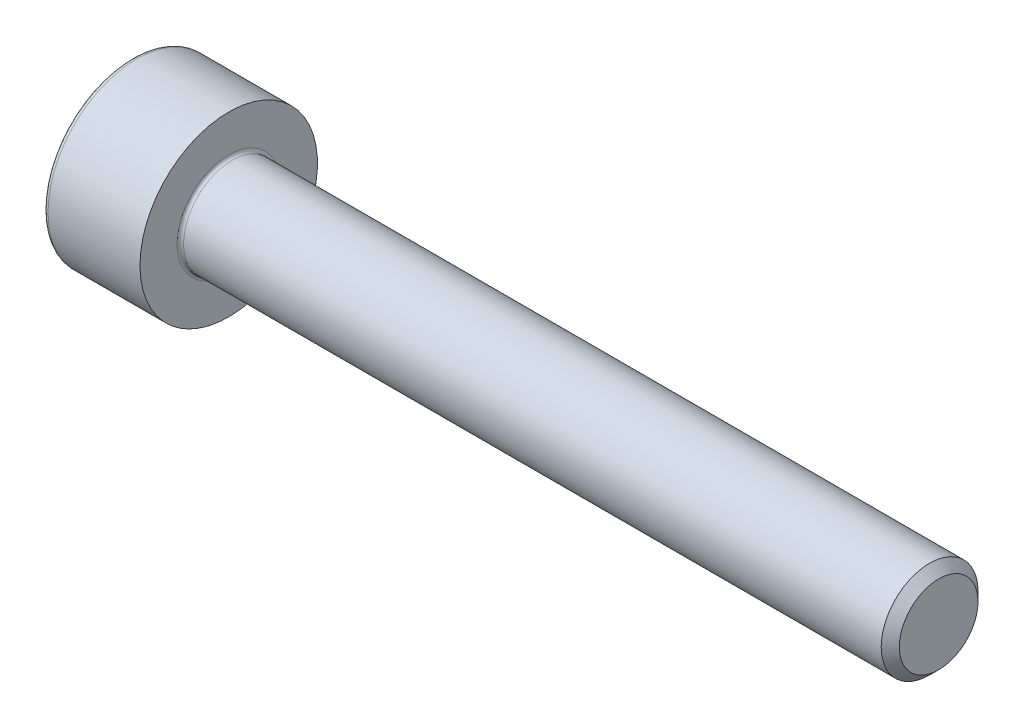
ISO-10303-21;
HEADER;
FILE_DESCRIPTION(('STEP AP214'),'2;1');
FILE_NAME('part.step','',(''),(''),'','','');
FILE_SCHEMA(('AUTOMOTIVE_DESIGN { 1 0 10303 214 1 1 1 1 }'));
ENDSEC;
DATA;
#1=APPLICATION_CONTEXT('core data for automotive mechanical design processes');
#2=APPLICATION_PROTOCOL_DEFINITION('international standard','automotive_design',2000,#1);
#3=PRODUCT_CONTEXT('',#1,'mechanical');
#4=PRODUCT('Part','Part','',(#3));
#5=PRODUCT_RELATED_PRODUCT_CATEGORY('part','',(#4));
#6=PRODUCT_DEFINITION_FORMATION('','',#4);
#7=PRODUCT_DEFINITION_CONTEXT('part definition',#1,'design');
#8=PRODUCT_DEFINITION('design','',#6,#7);
#9=PRODUCT_DEFINITION_SHAPE('','',#8);
#10=(LENGTH_UNIT() NAMED_UNIT(*) SI_UNIT(.MILLI.,.METRE.));
#11=(NAMED_UNIT(*) PLANE_ANGLE_UNIT() SI_UNIT($,.RADIAN.));
#12=(NAMED_UNIT(*) SI_UNIT($,.STERADIAN.) SOLID_ANGLE_UNIT());
#13=UNCERTAINTY_MEASURE_WITH_UNIT(LENGTH_MEASURE(1.E-05),#10,'distance_accuracy_value','');
#14=(GEOMETRIC_REPRESENTATION_CONTEXT(3) GLOBAL_UNCERTAINTY_ASSIGNED_CONTEXT((#13)) GLOBAL_UNIT_ASSIGNED_CONTEXT((#10,
#11,#12)) REPRESENTATION_CONTEXT('',''));
#15=CARTESIAN_POINT('',(0.,0.,0.));
#16=DIRECTION('',(0.,0.,1.));
#17=DIRECTION('',(1.,0.,0.));
#18=AXIS2_PLACEMENT_3D('',#15,#16,#17);
#19=CARTESIAN_POINT('',(1.29999999995789,0.,0.));
#20=DIRECTION('',(-1.,0.,0.));
#21=DIRECTION('',(0.,0.,1.));
#22=AXIS2_PLACEMENT_3D('',#19,#20,#21);
#23=CONICAL_SURFACE('',#22,1.27999999995154,1.04719755062551);
#24=CARTESIAN_POINT('',(2.03900834540605,0.,5.6843418860808E-11));
#25=VERTEX_POINT('',#24);
#26=VERTEX_LOOP('',#25);
#27=FACE_BOUND('',#26,.T.);
#28=CARTESIAN_POINT('',(1.29999999995789,0.,0.));
#29=DIRECTION('',(-1.,0.,0.));
#30=DIRECTION('',(0.,0.,1.));
#31=AXIS2_PLACEMENT_3D('',#28,#29,#30);
#32=CIRCLE('',#31,1.27999999995154);
#33=CARTESIAN_POINT('',(1.29999999997895,1.1085125168231,-0.639999999987889));
#34=VERTEX_POINT('',#33);
#35=CARTESIAN_POINT('',(1.29999999998041,-2.36380192933726E-12,-1.27999999997577));
#36=VERTEX_POINT('',#35);
#37=EDGE_CURVE('E87',#34,#36,#32,.T.);
#38=ORIENTED_EDGE('',*,*,#37,.T.);
#39=CARTESIAN_POINT('',(1.29999999995789,0.,0.));
#40=DIRECTION('',(-1.,0.,0.));
#41=DIRECTION('',(0.,0.,1.));
#42=AXIS2_PLACEMENT_3D('',#39,#40,#41);
#43=CIRCLE('',#42,1.27999999995154);
#44=CARTESIAN_POINT('',(1.29999999996884,-1.1085125168231,-0.639999999987886));
#45=VERTEX_POINT('',#44);
#46=EDGE_CURVE('E89',#36,#45,#43,.T.);
#47=ORIENTED_EDGE('',*,*,#46,.T.);
#48=CARTESIAN_POINT('',(1.29999999995789,0.,0.));
#49=DIRECTION('',(-1.,0.,0.));
#50=DIRECTION('',(0.,0.,1.));
#51=AXIS2_PLACEMENT_3D('',#48,#49,#50);
#52=CIRCLE('',#51,1.27999999995154);
#53=CARTESIAN_POINT('',(1.29999999996884,-1.1085125168231,0.639999999987887));
#54=VERTEX_POINT('',#53);
#55=EDGE_CURVE('E105',#45,#54,#52,.T.);
#56=ORIENTED_EDGE('',*,*,#55,.T.);
#57=CARTESIAN_POINT('',(1.29999999995789,0.,0.));
#58=DIRECTION('',(-1.,0.,0.));
#59=DIRECTION('',(0.,0.,1.));
#60=AXIS2_PLACEMENT_3D('',#57,#58,#59);
#61=CIRCLE('',#60,1.27999999995154);
#62=CARTESIAN_POINT('',(1.29999999997895,0.,1.27999999997577));
#63=VERTEX_POINT('',#62);
#64=EDGE_CURVE('E229',#54,#63,#61,.T.);
#65=ORIENTED_EDGE('',*,*,#64,.T.);
#66=CARTESIAN_POINT('',(1.29999999995789,0.,0.));
#67=DIRECTION('',(-1.,0.,0.));
#68=DIRECTION('',(0.,0.,1.));
#69=AXIS2_PLACEMENT_3D('',#66,#67,#68);
#70=CIRCLE('',#69,1.27999999995154);
#71=CARTESIAN_POINT('',(1.29999999996884,1.1085125168231,0.639999999987884));
#72=VERTEX_POINT('',#71);
#73=EDGE_CURVE('E231',#63,#72,#70,.T.);
#74=ORIENTED_EDGE('',*,*,#73,.T.);
#75=CARTESIAN_POINT('',(1.29999999995789,0.,0.));
#76=DIRECTION('',(-1.,0.,0.));
#77=DIRECTION('',(0.,0.,1.));
#78=AXIS2_PLACEMENT_3D('',#75,#76,#77);
#79=CIRCLE('',#78,1.27999999995154);
#80=EDGE_CURVE('E66',#72,#34,#79,.T.);
#81=ORIENTED_EDGE('',*,*,#80,.T.);
#82=EDGE_LOOP('',(#38,#47,#56,#65,#74,#81));
#83=FACE_BOUND('',#82,.T.);
#84=ADVANCED_FACE('F16',(#27,#83),#23,.F.);
#85=CARTESIAN_POINT('',(1.3,1.47801668912544,0.));
#86=DIRECTION('',(1.,0.,0.));
#87=DIRECTION('',(0.,0.,-1.));
#88=AXIS2_PLACEMENT_3D('',#85,#86,#87);
#89=PLANE('',#88);
#90=ORIENTED_EDGE('',*,*,#37,.F.);
#91=DIRECTION('',(0.,0.500000000000002,0.866025403784438));
#92=VECTOR('',#91,1.);
#93=CARTESIAN_POINT('',(1.29999999997895,1.47801668912544,0.));
#94=LINE('',#93,#92);
#95=CARTESIAN_POINT('',(1.29999999999045,0.739008344563736,-1.27999999999839));
#96=VERTEX_POINT('',#95);
#97=EDGE_CURVE('E93',#34,#96,#94,.F.);
#98=ORIENTED_EDGE('',*,*,#97,.T.);
#99=DIRECTION('',(0.,1.,0.));
#100=VECTOR('',#99,1.);
#101=CARTESIAN_POINT('',(1.30000000000293,0.739008344562715,-1.28));
#102=LINE('',#101,#100);
#103=EDGE_CURVE('E76',#96,#36,#102,.F.);
#104=ORIENTED_EDGE('',*,*,#103,.T.);
#105=EDGE_LOOP('',(#90,#98,#104));
#106=FACE_BOUND('',#105,.T.);
#107=ADVANCED_FACE('F84',(#106),#89,.F.);
#108=CARTESIAN_POINT('',(1.3,1.47801668912544,0.));
#109=DIRECTION('',(1.,0.,0.));
#110=DIRECTION('',(0.,0.,-1.));
#111=AXIS2_PLACEMENT_3D('',#108,#109,#110);
#112=PLANE('',#111);
#113=ORIENTED_EDGE('',*,*,#80,.F.);
#114=DIRECTION('',(0.,0.499999999999999,-0.866025403784439));
#115=VECTOR('',#114,1.);
#116=CARTESIAN_POINT('',(1.3,1.47801668912544,0.));
#117=LINE('',#116,#115);
#118=CARTESIAN_POINT('',(1.3,1.47801668912544,0.));
#119=VERTEX_POINT('',#118);
#120=EDGE_CURVE('E177',#119,#72,#117,.F.);
#121=ORIENTED_EDGE('',*,*,#120,.F.);
#122=DIRECTION('',(0.,0.500000000000002,0.866025403784438));
#123=VECTOR('',#122,1.);
#124=CARTESIAN_POINT('',(1.3,1.47801668912544,0.));
#125=LINE('',#124,#123);
#126=EDGE_CURVE('E113',#119,#34,#125,.F.);
#127=ORIENTED_EDGE('',*,*,#126,.T.);
#128=EDGE_LOOP('',(#113,#121,#127));
#129=FACE_BOUND('',#128,.T.);
#130=ADVANCED_FACE('F240',(#129),#112,.F.);
#131=CARTESIAN_POINT('',(1.3,1.47801668912544,0.));
#132=DIRECTION('',(1.,0.,0.));
#133=DIRECTION('',(0.,0.,-1.));
#134=AXIS2_PLACEMENT_3D('',#131,#132,#133);
#135=PLANE('',#134);
#136=ORIENTED_EDGE('',*,*,#73,.F.);
#137=DIRECTION('',(0.,-1.,0.));
#138=VECTOR('',#137,1.);
#139=CARTESIAN_POINT('',(1.29999999997895,-0.739008344562723,1.28));
#140=LINE('',#139,#138);
#141=CARTESIAN_POINT('',(1.29999999998273,0.73900834456272,1.28));
#142=VERTEX_POINT('',#141);
#143=EDGE_CURVE('E152',#63,#142,#140,.F.);
#144=ORIENTED_EDGE('',*,*,#143,.T.);
#145=DIRECTION('',(0.,0.499999999999999,-0.866025403784439));
#146=VECTOR('',#145,1.);
#147=CARTESIAN_POINT('',(1.29999999997978,1.47801668912544,0.));
#148=LINE('',#147,#146);
#149=EDGE_CURVE('E172',#72,#142,#148,.F.);
#150=ORIENTED_EDGE('',*,*,#149,.F.);
#151=EDGE_LOOP('',(#136,#144,#150));
#152=FACE_BOUND('',#151,.T.);
#153=ADVANCED_FACE('F241',(#152),#135,.F.);
#154=CARTESIAN_POINT('',(1.3,1.47801668912544,0.));
#155=DIRECTION('',(1.,0.,0.));
#156=DIRECTION('',(0.,0.,-1.));
#157=AXIS2_PLACEMENT_3D('',#154,#155,#156);
#158=PLANE('',#157);
#159=ORIENTED_EDGE('',*,*,#64,.F.);
#160=DIRECTION('',(0.,0.500000000000001,0.866025403784438));
#161=VECTOR('',#160,1.);
#162=CARTESIAN_POINT('',(1.3,-0.739008344562723,1.28));
#163=LINE('',#162,#161);
#164=CARTESIAN_POINT('',(1.3,-0.739008344562723,1.28));
#165=VERTEX_POINT('',#164);
#166=EDGE_CURVE('E130',#165,#54,#163,.F.);
#167=ORIENTED_EDGE('',*,*,#166,.F.);
#168=DIRECTION('',(0.,-1.,0.));
#169=VECTOR('',#168,1.);
#170=CARTESIAN_POINT('',(1.3,-0.739008344562723,1.28));
#171=LINE('',#170,#169);
#172=EDGE_CURVE('E155',#165,#63,#171,.F.);
#173=ORIENTED_EDGE('',*,*,#172,.T.);
#174=EDGE_LOOP('',(#159,#167,#173));
#175=FACE_BOUND('',#174,.T.);
#176=ADVANCED_FACE('F332',(#175),#158,.F.);
#177=CARTESIAN_POINT('',(1.3,1.47801668912544,0.));
#178=DIRECTION('',(1.,0.,0.));
#179=DIRECTION('',(0.,0.,-1.));
#180=AXIS2_PLACEMENT_3D('',#177,#178,#179);
#181=PLANE('',#180);
#182=ORIENTED_EDGE('',*,*,#55,.F.);
#183=DIRECTION('',(0.,-0.499999999999999,0.866025403784439));
#184=VECTOR('',#183,1.);
#185=CARTESIAN_POINT('',(1.29999999999455,-1.47801668912545,0.));
#186=LINE('',#185,#184);
#187=CARTESIAN_POINT('',(1.29999999999054,-1.47801668912545,0.));
#188=VERTEX_POINT('',#187);
#189=EDGE_CURVE('E124',#188,#45,#186,.F.);
#190=ORIENTED_EDGE('',*,*,#189,.F.);
#191=DIRECTION('',(0.,0.500000000000001,0.866025403784438));
#192=VECTOR('',#191,1.);
#193=CARTESIAN_POINT('',(1.29999999997978,-0.739008344562723,1.28));
#194=LINE('',#193,#192);
#195=EDGE_CURVE('E125',#54,#188,#194,.F.);
#196=ORIENTED_EDGE('',*,*,#195,.F.);
#197=EDGE_LOOP('',(#182,#190,#196));
#198=FACE_BOUND('',#197,.T.);
#199=ADVANCED_FACE('F329',(#198),#181,.F.);
#200=CARTESIAN_POINT('',(1.3,1.47801668912544,0.));
#201=DIRECTION('',(1.,0.,0.));
#202=DIRECTION('',(0.,0.,-1.));
#203=AXIS2_PLACEMENT_3D('',#200,#201,#202);
#204=PLANE('',#203);
#205=ORIENTED_EDGE('',*,*,#46,.F.);
#206=DIRECTION('',(0.,1.,0.));
#207=VECTOR('',#206,1.);
#208=CARTESIAN_POINT('',(1.29999999997781,0.739008344562715,-1.28));
#209=LINE('',#208,#207);
#210=CARTESIAN_POINT('',(1.2999999999825,-0.739008344562726,-1.28));
#211=VERTEX_POINT('',#210);
#212=EDGE_CURVE('E95',#36,#211,#209,.F.);
#213=ORIENTED_EDGE('',*,*,#212,.T.);
#214=DIRECTION('',(0.,-0.499999999999999,0.866025403784439));
#215=VECTOR('',#214,1.);
#216=CARTESIAN_POINT('',(1.29999999997978,-1.47801668912545,0.));
#217=LINE('',#216,#215);
#218=EDGE_CURVE('E103',#45,#211,#217,.F.);
#219=ORIENTED_EDGE('',*,*,#218,.F.);
#220=EDGE_LOOP('',(#205,#213,#219));
#221=FACE_BOUND('',#220,.T.);
#222=ADVANCED_FACE('F100',(#221),#204,.F.);
#223=CARTESIAN_POINT('',(1.3,0.739008344562715,-1.28));
#224=DIRECTION('',(0.,0.,-1.));
#225=DIRECTION('',(0.,1.,0.));
#226=AXIS2_PLACEMENT_3D('',#223,#224,#225);
#227=PLANE('',#226);
#228=ORIENTED_EDGE('',*,*,#103,.F.);
#229=DIRECTION('',(1.,0.,0.));
#230=VECTOR('',#229,1.);
#231=CARTESIAN_POINT('',(1.3,0.739008344564118,-1.27999999999758));
#232=LINE('',#231,#230);
#233=CARTESIAN_POINT('',(0.,0.739008344563587,-1.27999999999845));
#234=VERTEX_POINT('',#233);
#235=EDGE_CURVE('E111',#96,#234,#232,.F.);
#236=ORIENTED_EDGE('',*,*,#235,.T.);
#237=DIRECTION('',(0.,1.,0.));
#238=VECTOR('',#237,1.);
#239=CARTESIAN_POINT('',(0.,0.,-1.28));
#240=LINE('',#239,#238);
#241=CARTESIAN_POINT('',(0.,-0.739008344562726,-1.28));
#242=VERTEX_POINT('',#241);
#243=EDGE_CURVE('E199',#242,#234,#240,.T.);
#244=ORIENTED_EDGE('',*,*,#243,.F.);
#245=DIRECTION('',(1.,0.,0.));
#246=VECTOR('',#245,1.);
#247=CARTESIAN_POINT('',(1.3,-0.739008344562726,-1.28));
#248=LINE('',#247,#246);
#249=EDGE_CURVE('E110',#211,#242,#248,.F.);
#250=ORIENTED_EDGE('',*,*,#249,.F.);
#251=ORIENTED_EDGE('',*,*,#212,.F.);
#252=EDGE_LOOP('',(#228,#236,#244,#250,#251));
#253=FACE_BOUND('',#252,.T.);
#254=ADVANCED_FACE('F107',(#253),#227,.F.);
#255=CARTESIAN_POINT('',(1.3,1.47801668912544,0.));
#256=DIRECTION('',(0.,0.866025403784438,-0.500000000000002));
#257=DIRECTION('',(0.,0.500000000000002,0.866025403784438));
#258=AXIS2_PLACEMENT_3D('',#255,#256,#257);
#259=PLANE('',#258);
#260=ORIENTED_EDGE('',*,*,#126,.F.);
#261=DIRECTION('',(1.,0.,0.));
#262=VECTOR('',#261,1.);
#263=CARTESIAN_POINT('',(1.3,1.47801668912544,0.));
#264=LINE('',#263,#262);
#265=CARTESIAN_POINT('',(0.,1.47801668912544,0.));
#266=VERTEX_POINT('',#265);
#267=EDGE_CURVE('E187',#266,#119,#264,.T.);
#268=ORIENTED_EDGE('',*,*,#267,.F.);
#269=DIRECTION('',(0.,0.500000000000028,0.866025403784422));
#270=VECTOR('',#269,1.);
#271=CARTESIAN_POINT('',(0.,0.739008344562973,-1.27999999999947));
#272=LINE('',#271,#270);
#273=EDGE_CURVE('E182',#234,#266,#272,.T.);
#274=ORIENTED_EDGE('',*,*,#273,.F.);
#275=ORIENTED_EDGE('',*,*,#235,.F.);
#276=ORIENTED_EDGE('',*,*,#97,.F.);
#277=EDGE_LOOP('',(#260,#268,#274,#275,#276));
#278=FACE_BOUND('',#277,.T.);
#279=ADVANCED_FACE('F250',(#278),#259,.F.);
#280=CARTESIAN_POINT('',(1.3,1.47801668912544,0.));
#281=DIRECTION('',(0.,-0.866025403784439,-0.499999999999999));
#282=DIRECTION('',(0.,0.499999999999999,-0.866025403784439));
#283=AXIS2_PLACEMENT_3D('',#280,#281,#282);
#284=PLANE('',#283);
#285=DIRECTION('',(1.,0.,0.));
#286=VECTOR('',#285,1.);
#287=CARTESIAN_POINT('',(1.3,0.73900834456272,1.28));
#288=LINE('',#287,#286);
#289=CARTESIAN_POINT('',(0.,0.739008344562719,1.28));
#290=VERTEX_POINT('',#289);
#291=EDGE_CURVE('E158',#142,#290,#288,.F.);
#292=ORIENTED_EDGE('',*,*,#291,.T.);
#293=DIRECTION('',(0.,-0.499999999999999,0.866025403784439));
#294=VECTOR('',#293,1.);
#295=CARTESIAN_POINT('',(0.,1.47801668912544,0.));
#296=LINE('',#295,#294);
#297=EDGE_CURVE('E163',#266,#290,#296,.T.);
#298=ORIENTED_EDGE('',*,*,#297,.F.);
#299=ORIENTED_EDGE('',*,*,#267,.T.);
#300=ORIENTED_EDGE('',*,*,#120,.T.);
#301=ORIENTED_EDGE('',*,*,#149,.T.);
#302=EDGE_LOOP('',(#292,#298,#299,#300,#301));
#303=FACE_BOUND('',#302,.T.);
#304=ADVANCED_FACE('F244',(#303),#284,.T.);
#305=CARTESIAN_POINT('',(1.3,-0.739008344562723,1.28));
#306=DIRECTION('',(0.,0.,1.));
#307=DIRECTION('',(0.,-1.,0.));
#308=AXIS2_PLACEMENT_3D('',#305,#306,#307);
#309=PLANE('',#308);
#310=ORIENTED_EDGE('',*,*,#172,.F.);
#311=DIRECTION('',(1.,0.,0.));
#312=VECTOR('',#311,1.);
#313=CARTESIAN_POINT('',(1.3,-0.739008344562723,1.28));
#314=LINE('',#313,#312);
#315=CARTESIAN_POINT('',(0.,-0.739008344562723,1.28));
#316=VERTEX_POINT('',#315);
#317=EDGE_CURVE('E147',#316,#165,#314,.T.);
#318=ORIENTED_EDGE('',*,*,#317,.F.);
#319=DIRECTION('',(0.,1.,0.));
#320=VECTOR('',#319,1.);
#321=CARTESIAN_POINT('',(0.,0.,1.28));
#322=LINE('',#321,#320);
#323=EDGE_CURVE('E142',#290,#316,#322,.F.);
#324=ORIENTED_EDGE('',*,*,#323,.F.);
#325=ORIENTED_EDGE('',*,*,#291,.F.);
#326=ORIENTED_EDGE('',*,*,#143,.F.);
#327=EDGE_LOOP('',(#310,#318,#324,#325,#326));
#328=FACE_BOUND('',#327,.T.);
#329=ADVANCED_FACE('F317',(#328),#309,.F.);
#330=CARTESIAN_POINT('',(1.3,-0.739008344562723,1.28));
#331=DIRECTION('',(0.,0.866025403784438,-0.500000000000001));
#332=DIRECTION('',(0.,0.500000000000001,0.866025403784438));
#333=AXIS2_PLACEMENT_3D('',#330,#331,#332);
#334=PLANE('',#333);
#335=DIRECTION('',(1.,0.,0.));
#336=VECTOR('',#335,1.);
#337=CARTESIAN_POINT('',(1.3,-1.47801668912545,0.));
#338=LINE('',#337,#336);
#339=CARTESIAN_POINT('',(0.,-1.47801668912545,0.));
#340=VERTEX_POINT('',#339);
#341=EDGE_CURVE('E121',#340,#188,#338,.T.);
#342=ORIENTED_EDGE('',*,*,#341,.F.);
#343=DIRECTION('',(0.,-0.500000000000001,-0.866025403784438));
#344=VECTOR('',#343,1.);
#345=CARTESIAN_POINT('',(0.,-0.739008344562723,1.28));
#346=LINE('',#345,#344);
#347=EDGE_CURVE('E137',#316,#340,#346,.T.);
#348=ORIENTED_EDGE('',*,*,#347,.F.);
#349=ORIENTED_EDGE('',*,*,#317,.T.);
#350=ORIENTED_EDGE('',*,*,#166,.T.);
#351=ORIENTED_EDGE('',*,*,#195,.T.);
#352=EDGE_LOOP('',(#342,#348,#349,#350,#351));
#353=FACE_BOUND('',#352,.T.);
#354=ADVANCED_FACE('F275',(#353),#334,.T.);
#355=CARTESIAN_POINT('',(1.3,-1.47801668912545,0.));
#356=DIRECTION('',(0.,0.866025403784439,0.499999999999999));
#357=DIRECTION('',(0.,-0.499999999999999,0.866025403784439));
#358=AXIS2_PLACEMENT_3D('',#355,#356,#357);
#359=PLANE('',#358);
#360=ORIENTED_EDGE('',*,*,#249,.T.);
#361=DIRECTION('',(0.,0.499999999999999,-0.866025403784439));
#362=VECTOR('',#361,1.);
#363=CARTESIAN_POINT('',(0.,-1.47801668912545,0.));
#364=LINE('',#363,#362);
#365=EDGE_CURVE('E133',#340,#242,#364,.T.);
#366=ORIENTED_EDGE('',*,*,#365,.F.);
#367=ORIENTED_EDGE('',*,*,#341,.T.);
#368=ORIENTED_EDGE('',*,*,#189,.T.);
#369=ORIENTED_EDGE('',*,*,#218,.T.);
#370=EDGE_LOOP('',(#360,#366,#367,#368,#369));
#371=FACE_BOUND('',#370,.T.);
#372=ADVANCED_FACE('F269',(#371),#359,.T.);
#373=CARTESIAN_POINT('',(0.,0.,0.));
#374=DIRECTION('',(-1.,0.,0.));
#375=DIRECTION('',(0.,0.,1.));
#376=AXIS2_PLACEMENT_3D('',#373,#374,#375);
#377=PLANE('',#376);
#378=ORIENTED_EDGE('',*,*,#347,.T.);
#379=ORIENTED_EDGE('',*,*,#365,.T.);
#380=ORIENTED_EDGE('',*,*,#243,.T.);
#381=ORIENTED_EDGE('',*,*,#273,.T.);
#382=ORIENTED_EDGE('',*,*,#297,.T.);
#383=ORIENTED_EDGE('',*,*,#323,.T.);
#384=EDGE_LOOP('',(#378,#379,#380,#381,#382,#383));
#385=FACE_BOUND('',#384,.T.);
#386=CARTESIAN_POINT('',(0.,0.,0.));
#387=DIRECTION('',(-1.,0.,0.));
#388=DIRECTION('',(0.,0.,1.));
#389=AXIS2_PLACEMENT_3D('',#386,#387,#388);
#390=CIRCLE('',#389,2.6);
#391=CARTESIAN_POINT('',(0.,0.,2.6));
#392=VERTEX_POINT('',#391);
#393=EDGE_CURVE('E136',#392,#392,#390,.F.);
#394=ORIENTED_EDGE('',*,*,#393,.F.);
#395=EDGE_LOOP('',(#394));
#396=FACE_BOUND('',#395,.T.);
#397=ADVANCED_FACE('F270',(#385,#396),#377,.T.);
#398=CARTESIAN_POINT('',(0.15,0.,0.));
#399=DIRECTION('',(-1.,0.,0.));
#400=DIRECTION('',(0.,0.,1.));
#401=AXIS2_PLACEMENT_3D('',#398,#399,#400);
#402=TOROIDAL_SURFACE('',#401,2.6,0.150000000000001);
#403=ORIENTED_EDGE('',*,*,#393,.T.);
#404=EDGE_LOOP('',(#403));
#405=FACE_BOUND('',#404,.T.);
#406=CARTESIAN_POINT('',(0.149999999999997,0.,0.));
#407=DIRECTION('',(-1.,0.,0.));
#408=DIRECTION('',(0.,0.,1.));
#409=AXIS2_PLACEMENT_3D('',#406,#407,#408);
#410=CIRCLE('',#409,2.75);
#411=CARTESIAN_POINT('',(0.149999999999997,0.,2.75));
#412=VERTEX_POINT('',#411);
#413=EDGE_CURVE('E225',#412,#412,#410,.F.);
#414=ORIENTED_EDGE('',*,*,#413,.F.);
#415=EDGE_LOOP('',(#414));
#416=FACE_BOUND('',#415,.T.);
#417=ADVANCED_FACE('F309',(#405,#416),#402,.T.);
#418=CARTESIAN_POINT('',(-31.75,0.,0.));
#419=DIRECTION('',(-1.,0.,0.));
#420=DIRECTION('',(0.,0.,1.));
#421=AXIS2_PLACEMENT_3D('',#418,#419,#420);
#422=CYLINDRICAL_SURFACE('',#421,2.75);
#423=ORIENTED_EDGE('',*,*,#413,.T.);
#424=EDGE_LOOP('',(#423));
#425=FACE_BOUND('',#424,.T.);
#426=CARTESIAN_POINT('',(3.,0.,0.));
#427=DIRECTION('',(-1.,0.,0.));
#428=DIRECTION('',(0.,0.,1.));
#429=AXIS2_PLACEMENT_3D('',#426,#427,#428);
#430=CIRCLE('',#429,2.75);
#431=CARTESIAN_POINT('',(3.,0.,2.75));
#432=VERTEX_POINT('',#431);
#433=EDGE_CURVE('E221',#432,#432,#430,.F.);
#434=ORIENTED_EDGE('',*,*,#433,.F.);
#435=EDGE_LOOP('',(#434));
#436=FACE_BOUND('',#435,.T.);
#437=ADVANCED_FACE('F304',(#425,#436),#422,.T.);
#438=CARTESIAN_POINT('',(3.,2.75,0.));
#439=DIRECTION('',(1.,0.,0.));
#440=DIRECTION('',(0.,0.,-1.));
#441=AXIS2_PLACEMENT_3D('',#438,#439,#440);
#442=PLANE('',#441);
#443=CARTESIAN_POINT('',(3.,0.,-1.6));
#444=CARTESIAN_POINT('',(3.,-0.303340316940371,-1.6));
#445=CARTESIAN_POINT('',(3.,-0.588951535299003,-1.48766128169989));
#446=CARTESIAN_POINT('',(3.,-0.893758910761554,-1.36777218881108));
#447=CARTESIAN_POINT('',(3.,-1.13137084989848,-1.13137084989847));
#448=CARTESIAN_POINT('',(3.,-1.36320001114264,-0.900722826418799));
#449=CARTESIAN_POINT('',(3.,-1.4876612816999,-0.588951535298987));
#450=CARTESIAN_POINT('',(3.,-1.59961371388254,-0.308514463032964));
#451=CARTESIAN_POINT('',(3.,-1.6,0.));
#452=B_SPLINE_CURVE_WITH_KNOTS('',2,(#443,#444,#445,#446,#447,#448,#449,#450,#451),
.UNSPECIFIED.,.F.,.F.,(3,2,2,2,3),(0.,0.25,0.5,0.75,1.),.UNSPECIFIED.);
#453=CARTESIAN_POINT('',(3.,0.,-1.6));
#454=VERTEX_POINT('',#453);
#455=CARTESIAN_POINT('',(3.,-1.6,0.));
#456=VERTEX_POINT('',#455);
#457=EDGE_CURVE('E33',#454,#456,#452,.T.);
#458=ORIENTED_EDGE('',*,*,#457,.T.);
#459=CARTESIAN_POINT('',(3.,0.,0.));
#460=DIRECTION('',(1.,0.,0.));
#461=DIRECTION('',(0.,1.,0.));
#462=AXIS2_PLACEMENT_3D('',#459,#460,#461);
#463=CIRCLE('',#462,1.6);
#464=CARTESIAN_POINT('',(3.,0.,1.6));
#465=VERTEX_POINT('',#464);
#466=EDGE_CURVE('E216',#456,#465,#463,.F.);
#467=ORIENTED_EDGE('',*,*,#466,.T.);
#468=CARTESIAN_POINT('',(3.,0.,1.6));
#469=CARTESIAN_POINT('',(3.,0.303340316940521,1.6));
#470=CARTESIAN_POINT('',(3.,0.588951535298997,1.48766128169989));
#471=CARTESIAN_POINT('',(3.,0.893758910762034,1.36777218881083));
#472=CARTESIAN_POINT('',(3.,1.13137084989847,1.13137084989848));
#473=CARTESIAN_POINT('',(3.,1.3632000111437,0.900722826417524));
#474=CARTESIAN_POINT('',(3.,1.48766128169989,0.588951535299006));
#475=CARTESIAN_POINT('',(3.,1.59961371388275,0.308514463031205));
#476=CARTESIAN_POINT('',(3.,1.6,0.));
#477=B_SPLINE_CURVE_WITH_KNOTS('',2,(#468,#469,#470,#471,#472,#473,#474,#475,#476),
.UNSPECIFIED.,.F.,.F.,(3,2,2,2,3),(0.,0.25,0.5,0.75,1.),.UNSPECIFIED.);
#478=CARTESIAN_POINT('',(3.,1.6,0.));
#479=VERTEX_POINT('',#478);
#480=EDGE_CURVE('E218',#465,#479,#477,.T.);
#481=ORIENTED_EDGE('',*,*,#480,.T.);
#482=CARTESIAN_POINT('',(3.,0.,0.));
#483=DIRECTION('',(1.,0.,0.));
#484=DIRECTION('',(0.,1.,0.));
#485=AXIS2_PLACEMENT_3D('',#482,#483,#484);
#486=CIRCLE('',#485,1.6);
#487=EDGE_CURVE('E219',#479,#454,#486,.F.);
#488=ORIENTED_EDGE('',*,*,#487,.T.);
#489=EDGE_LOOP('',(#458,#467,#481,#488));
#490=FACE_BOUND('',#489,.T.);
#491=ORIENTED_EDGE('',*,*,#433,.T.);
#492=EDGE_LOOP('',(#491));
#493=FACE_BOUND('',#492,.T.);
#494=ADVANCED_FACE('F293',(#490,#493),#442,.T.);
#495=CARTESIAN_POINT('',(25.,1.2195,0.));
#496=DIRECTION('',(1.,0.,0.));
#497=DIRECTION('',(0.,0.,-1.));
#498=AXIS2_PLACEMENT_3D('',#495,#496,#497);
#499=PLANE('',#498);
#500=CARTESIAN_POINT('',(25.0000000000341,0.,0.));
#501=DIRECTION('',(-1.,0.,0.));
#502=DIRECTION('',(0.,-1.,0.));
#503=AXIS2_PLACEMENT_3D('',#500,#501,#502);
#504=CIRCLE('',#503,1.21949999987692);
#505=CARTESIAN_POINT('',(25.0000000000341,-1.21949999987692,0.));
#506=VERTEX_POINT('',#505);
#507=EDGE_CURVE('E213',#506,#506,#504,.T.);
#508=ORIENTED_EDGE('',*,*,#507,.F.);
#509=EDGE_LOOP('',(#508));
#510=FACE_BOUND('',#509,.T.);
#511=ADVANCED_FACE('F303',(#510),#499,.T.);
#512=CARTESIAN_POINT('',(3.1,0.,0.));
#513=DIRECTION('',(1.,0.,0.));
#514=DIRECTION('',(0.,1.,0.));
#515=AXIS2_PLACEMENT_3D('',#512,#513,#514);
#516=TOROIDAL_SURFACE('',#515,1.6,0.100000000000003);
#517=CARTESIAN_POINT('',(3.1,0.,0.));
#518=DIRECTION('',(-1.,0.,0.));
#519=DIRECTION('',(0.,0.,1.));
#520=AXIS2_PLACEMENT_3D('',#517,#518,#519);
#521=CIRCLE('',#520,1.5);
#522=CARTESIAN_POINT('',(3.1,0.,1.5));
#523=VERTEX_POINT('',#522);
#524=EDGE_CURVE('E11',#523,#523,#521,.F.);
#525=ORIENTED_EDGE('',*,*,#524,.F.);
#526=EDGE_LOOP('',(#525));
#527=FACE_BOUND('',#526,.T.);
#528=ORIENTED_EDGE('',*,*,#466,.F.);
#529=ORIENTED_EDGE('',*,*,#457,.F.);
#530=ORIENTED_EDGE('',*,*,#487,.F.);
#531=ORIENTED_EDGE('',*,*,#480,.F.);
#532=EDGE_LOOP('',(#528,#529,#530,#531));
#533=FACE_BOUND('',#532,.T.);
#534=ADVANCED_FACE('F18',(#527,#533),#516,.F.);
#535=CARTESIAN_POINT('',(24.7194999999465,0.,0.));
#536=DIRECTION('',(-1.,0.,0.));
#537=DIRECTION('',(0.,-1.,0.));
#538=AXIS2_PLACEMENT_3D('',#535,#536,#537);
#539=CONICAL_SURFACE('',#538,1.49999999990769,0.78539816329612);
#540=CARTESIAN_POINT('',(24.7195,0.,0.));
#541=DIRECTION('',(-1.,0.,0.));
#542=DIRECTION('',(0.,0.,1.));
#543=AXIS2_PLACEMENT_3D('',#540,#541,#542);
#544=CIRCLE('',#543,1.5);
#545=CARTESIAN_POINT('',(24.7195,0.,1.5));
#546=VERTEX_POINT('',#545);
#547=EDGE_CURVE('E25',#546,#546,#544,.T.);
#548=ORIENTED_EDGE('',*,*,#547,.F.);
#549=EDGE_LOOP('',(#548));
#550=FACE_BOUND('',#549,.T.);
#551=ORIENTED_EDGE('',*,*,#507,.T.);
#552=EDGE_LOOP('',(#551));
#553=FACE_BOUND('',#552,.T.);
#554=ADVANCED_FACE('F349',(#550,#553),#539,.T.);
#555=CARTESIAN_POINT('',(-31.75,0.,0.));
#556=DIRECTION('',(-1.,0.,0.));
#557=DIRECTION('',(0.,0.,1.));
#558=AXIS2_PLACEMENT_3D('',#555,#556,#557);
#559=CYLINDRICAL_SURFACE('',#558,1.5);
#560=ORIENTED_EDGE('',*,*,#524,.T.);
#561=EDGE_LOOP('',(#560));
#562=FACE_BOUND('',#561,.T.);
#563=ORIENTED_EDGE('',*,*,#547,.T.);
#564=EDGE_LOOP('',(#563));
#565=FACE_BOUND('',#564,.T.);
#566=ADVANCED_FACE('F347',(#562,#565),#559,.T.);
#567=CLOSED_SHELL('',(#84,#107,#130,#153,#176,#199,#222,#254,#279,#304,#329,#354,#372,#397,#417,
#437,#494,#511,#534,#554,#566));
#568=MANIFOLD_SOLID_BREP('B1',#567);
#569=ADVANCED_BREP_SHAPE_REPRESENTATION('',(#18,#568),#14);
#570=SHAPE_DEFINITION_REPRESENTATION(#9,#569);
ENDSEC;
END-ISO-10303-21;
